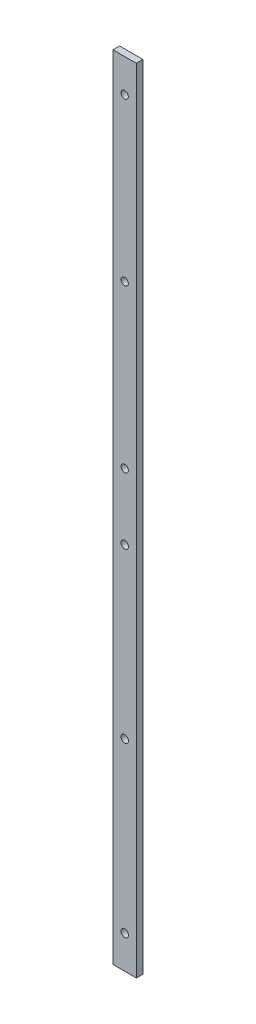
ISO-10303-21;
HEADER;
FILE_DESCRIPTION(('STEP AP214'),'2;1');
FILE_NAME('part.step','',(''),(''),'','','');
FILE_SCHEMA(('AUTOMOTIVE_DESIGN { 1 0 10303 214 1 1 1 1 }'));
ENDSEC;
DATA;
#1=APPLICATION_CONTEXT('core data for automotive mechanical design processes');
#2=APPLICATION_PROTOCOL_DEFINITION('international standard','automotive_design',2000,#1);
#3=PRODUCT_CONTEXT('',#1,'mechanical');
#4=PRODUCT('Part','Part','',(#3));
#5=PRODUCT_RELATED_PRODUCT_CATEGORY('part','',(#4));
#6=PRODUCT_DEFINITION_FORMATION('','',#4);
#7=PRODUCT_DEFINITION_CONTEXT('part definition',#1,'design');
#8=PRODUCT_DEFINITION('design','',#6,#7);
#9=PRODUCT_DEFINITION_SHAPE('','',#8);
#10=(LENGTH_UNIT() NAMED_UNIT(*) SI_UNIT(.MILLI.,.METRE.));
#11=(NAMED_UNIT(*) PLANE_ANGLE_UNIT() SI_UNIT($,.RADIAN.));
#12=(NAMED_UNIT(*) SI_UNIT($,.STERADIAN.) SOLID_ANGLE_UNIT());
#13=UNCERTAINTY_MEASURE_WITH_UNIT(LENGTH_MEASURE(1.E-05),#10,'distance_accuracy_value','');
#14=(GEOMETRIC_REPRESENTATION_CONTEXT(3) GLOBAL_UNCERTAINTY_ASSIGNED_CONTEXT((#13)) GLOBAL_UNIT_ASSIGNED_CONTEXT((#10,
#11,#12)) REPRESENTATION_CONTEXT('',''));
#15=CARTESIAN_POINT('',(0.,0.,0.));
#16=DIRECTION('',(0.,0.,1.));
#17=DIRECTION('',(1.,0.,0.));
#18=AXIS2_PLACEMENT_3D('',#15,#16,#17);
#19=CARTESIAN_POINT('',(0.,0.,3.));
#20=DIRECTION('',(0.,0.,1.));
#21=DIRECTION('',(1.,0.,0.));
#22=AXIS2_PLACEMENT_3D('',#19,#20,#21);
#23=PLANE('',#22);
#24=CARTESIAN_POINT('',(70.8508489375318,-31.6991439461708,3.));
#25=DIRECTION('',(0.,0.,1.));
#26=DIRECTION('',(1.,0.,0.));
#27=AXIS2_PLACEMENT_3D('',#24,#25,#26);
#28=CIRCLE('',#27,1.70000000000003);
#29=CARTESIAN_POINT('',(72.5508489375318,-31.6991439461708,3.));
#30=VERTEX_POINT('',#29);
#31=EDGE_CURVE('E139',#30,#30,#28,.T.);
#32=ORIENTED_EDGE('',*,*,#31,.F.);
#33=EDGE_LOOP('',(#32));
#34=FACE_BOUND('',#33,.T.);
#35=CARTESIAN_POINT('',(70.8508420677386,74.7510002553463,3.));
#36=DIRECTION('',(0.,0.,1.));
#37=DIRECTION('',(1.,0.,0.));
#38=AXIS2_PLACEMENT_3D('',#35,#36,#37);
#39=CIRCLE('',#38,1.65);
#40=CARTESIAN_POINT('',(72.5008420677386,74.7510002553463,3.));
#41=VERTEX_POINT('',#40);
#42=EDGE_CURVE('E127',#41,#41,#39,.T.);
#43=ORIENTED_EDGE('',*,*,#42,.F.);
#44=EDGE_LOOP('',(#43));
#45=FACE_BOUND('',#44,.T.);
#46=CARTESIAN_POINT('',(70.8508420677386,221.850888729095,3.));
#47=DIRECTION('',(0.,0.,1.));
#48=DIRECTION('',(1.,0.,0.));
#49=AXIS2_PLACEMENT_3D('',#46,#47,#48);
#50=CIRCLE('',#49,1.65000000000002);
#51=CARTESIAN_POINT('',(72.5008420677387,221.850888729095,3.));
#52=VERTEX_POINT('',#51);
#53=EDGE_CURVE('E106',#52,#52,#50,.T.);
#54=ORIENTED_EDGE('',*,*,#53,.F.);
#55=EDGE_LOOP('',(#54));
#56=FACE_BOUND('',#55,.T.);
#57=DIRECTION('',(0.,1.,0.));
#58=VECTOR('',#57,1.);
#59=CARTESIAN_POINT('',(76.1518031358719,236.850888729095,3.));
#60=LINE('',#59,#58);
#61=CARTESIAN_POINT('',(76.1518031358719,-123.149288147688,3.));
#62=VERTEX_POINT('',#61);
#63=CARTESIAN_POINT('',(76.1518031358719,236.850888729095,3.));
#64=VERTEX_POINT('',#63);
#65=EDGE_CURVE('E91',#62,#64,#60,.T.);
#66=ORIENTED_EDGE('',*,*,#65,.T.);
#67=DIRECTION('',(-1.,0.,0.));
#68=VECTOR('',#67,1.);
#69=CARTESIAN_POINT('',(65.5498809996054,236.850888729095,3.));
#70=LINE('',#69,#68);
#71=CARTESIAN_POINT('',(65.5498809996054,236.850888729095,3.));
#72=VERTEX_POINT('',#71);
#73=EDGE_CURVE('E86',#64,#72,#70,.T.);
#74=ORIENTED_EDGE('',*,*,#73,.T.);
#75=DIRECTION('',(3.81654985997715E-08,-0.999999999999999,0.));
#76=VECTOR('',#75,1.);
#77=CARTESIAN_POINT('',(65.5498947391916,-123.149288147688,3.));
#78=LINE('',#77,#76);
#79=CARTESIAN_POINT('',(65.5498947391916,-123.149288147688,3.));
#80=VERTEX_POINT('',#79);
#81=EDGE_CURVE('E89',#72,#80,#78,.T.);
#82=ORIENTED_EDGE('',*,*,#81,.T.);
#83=DIRECTION('',(1.,0.,0.));
#84=VECTOR('',#83,1.);
#85=CARTESIAN_POINT('',(65.5498947391916,-123.149288147688,3.));
#86=LINE('',#85,#84);
#87=EDGE_CURVE('E56',#80,#62,#86,.T.);
#88=ORIENTED_EDGE('',*,*,#87,.T.);
#89=EDGE_LOOP('',(#66,#74,#82,#88));
#90=FACE_BOUND('',#89,.T.);
#91=CARTESIAN_POINT('',(70.8508420677386,148.300944492221,3.));
#92=DIRECTION('',(0.,0.,1.));
#93=DIRECTION('',(1.,0.,0.));
#94=AXIS2_PLACEMENT_3D('',#91,#92,#93);
#95=CIRCLE('',#94,1.65000000000002);
#96=CARTESIAN_POINT('',(72.5008420677387,148.300944492221,3.));
#97=VERTEX_POINT('',#96);
#98=EDGE_CURVE('E121',#97,#97,#95,.T.);
#99=ORIENTED_EDGE('',*,*,#98,.F.);
#100=EDGE_LOOP('',(#99));
#101=FACE_BOUND('',#100,.T.);
#102=CARTESIAN_POINT('',(70.8508489375317,44.7510002553463,3.));
#103=DIRECTION('',(0.,0.,1.));
#104=DIRECTION('',(1.,0.,0.));
#105=AXIS2_PLACEMENT_3D('',#102,#103,#104);
#106=CIRCLE('',#105,1.7);
#107=CARTESIAN_POINT('',(72.5508489375317,44.7510002553463,3.));
#108=VERTEX_POINT('',#107);
#109=EDGE_CURVE('E133',#108,#108,#106,.T.);
#110=ORIENTED_EDGE('',*,*,#109,.F.);
#111=EDGE_LOOP('',(#110));
#112=FACE_BOUND('',#111,.T.);
#113=CARTESIAN_POINT('',(70.8508489375318,-108.149288147688,3.));
#114=DIRECTION('',(0.,0.,1.));
#115=DIRECTION('',(1.,0.,0.));
#116=AXIS2_PLACEMENT_3D('',#113,#114,#115);
#117=CIRCLE('',#116,1.69999999999998);
#118=CARTESIAN_POINT('',(72.5508489375317,-108.149288147688,3.));
#119=VERTEX_POINT('',#118);
#120=EDGE_CURVE('E145',#119,#119,#117,.T.);
#121=ORIENTED_EDGE('',*,*,#120,.F.);
#122=EDGE_LOOP('',(#121));
#123=FACE_BOUND('',#122,.T.);
#124=ADVANCED_FACE('F39',(#34,#45,#56,#90,#101,#112,#123),#23,.T.);
#125=CARTESIAN_POINT('',(0.,0.,0.));
#126=DIRECTION('',(0.,0.,1.));
#127=DIRECTION('',(1.,0.,0.));
#128=AXIS2_PLACEMENT_3D('',#125,#126,#127);
#129=PLANE('',#128);
#130=DIRECTION('',(0.,1.,0.));
#131=VECTOR('',#130,1.);
#132=CARTESIAN_POINT('',(76.1518031358719,236.850888729095,0.));
#133=LINE('',#132,#131);
#134=CARTESIAN_POINT('',(76.1518031358719,-123.149288147688,0.));
#135=VERTEX_POINT('',#134);
#136=CARTESIAN_POINT('',(76.1518031358719,236.850888729095,0.));
#137=VERTEX_POINT('',#136);
#138=EDGE_CURVE('E103',#135,#137,#133,.T.);
#139=ORIENTED_EDGE('',*,*,#138,.F.);
#140=DIRECTION('',(1.,0.,0.));
#141=VECTOR('',#140,1.);
#142=CARTESIAN_POINT('',(65.5498947391916,-123.149288147688,0.));
#143=LINE('',#142,#141);
#144=CARTESIAN_POINT('',(65.5498947391916,-123.149288147688,0.));
#145=VERTEX_POINT('',#144);
#146=EDGE_CURVE('E79',#145,#135,#143,.T.);
#147=ORIENTED_EDGE('',*,*,#146,.F.);
#148=DIRECTION('',(3.81654985997715E-08,-0.999999999999999,0.));
#149=VECTOR('',#148,1.);
#150=CARTESIAN_POINT('',(65.5498947391916,-123.149288147688,0.));
#151=LINE('',#150,#149);
#152=CARTESIAN_POINT('',(65.5498809996054,236.850888729095,0.));
#153=VERTEX_POINT('',#152);
#154=EDGE_CURVE('E73',#153,#145,#151,.T.);
#155=ORIENTED_EDGE('',*,*,#154,.F.);
#156=DIRECTION('',(-1.,0.,0.));
#157=VECTOR('',#156,1.);
#158=CARTESIAN_POINT('',(65.5498809996054,236.850888729095,0.));
#159=LINE('',#158,#157);
#160=EDGE_CURVE('E95',#137,#153,#159,.T.);
#161=ORIENTED_EDGE('',*,*,#160,.F.);
#162=EDGE_LOOP('',(#139,#147,#155,#161));
#163=FACE_BOUND('',#162,.T.);
#164=CARTESIAN_POINT('',(70.8508420677386,221.850888729095,0.));
#165=DIRECTION('',(0.,0.,1.));
#166=DIRECTION('',(1.,0.,0.));
#167=AXIS2_PLACEMENT_3D('',#164,#165,#166);
#168=CIRCLE('',#167,1.65000000000002);
#169=CARTESIAN_POINT('',(72.5008420677387,221.850888729095,0.));
#170=VERTEX_POINT('',#169);
#171=EDGE_CURVE('E118',#170,#170,#168,.T.);
#172=ORIENTED_EDGE('',*,*,#171,.T.);
#173=EDGE_LOOP('',(#172));
#174=FACE_BOUND('',#173,.T.);
#175=CARTESIAN_POINT('',(70.8508420677386,148.300944492221,0.));
#176=DIRECTION('',(0.,0.,1.));
#177=DIRECTION('',(1.,0.,0.));
#178=AXIS2_PLACEMENT_3D('',#175,#176,#177);
#179=CIRCLE('',#178,1.65000000000002);
#180=CARTESIAN_POINT('',(72.5008420677387,148.300944492221,0.));
#181=VERTEX_POINT('',#180);
#182=EDGE_CURVE('E124',#181,#181,#179,.T.);
#183=ORIENTED_EDGE('',*,*,#182,.T.);
#184=EDGE_LOOP('',(#183));
#185=FACE_BOUND('',#184,.T.);
#186=CARTESIAN_POINT('',(70.8508420677386,74.7510002553463,0.));
#187=DIRECTION('',(0.,0.,1.));
#188=DIRECTION('',(1.,0.,0.));
#189=AXIS2_PLACEMENT_3D('',#186,#187,#188);
#190=CIRCLE('',#189,1.65);
#191=CARTESIAN_POINT('',(72.5008420677386,74.7510002553463,0.));
#192=VERTEX_POINT('',#191);
#193=EDGE_CURVE('E130',#192,#192,#190,.T.);
#194=ORIENTED_EDGE('',*,*,#193,.T.);
#195=EDGE_LOOP('',(#194));
#196=FACE_BOUND('',#195,.T.);
#197=CARTESIAN_POINT('',(70.8508489375317,44.7510002553463,0.));
#198=DIRECTION('',(0.,0.,1.));
#199=DIRECTION('',(1.,0.,0.));
#200=AXIS2_PLACEMENT_3D('',#197,#198,#199);
#201=CIRCLE('',#200,1.7);
#202=CARTESIAN_POINT('',(72.5508489375317,44.7510002553463,0.));
#203=VERTEX_POINT('',#202);
#204=EDGE_CURVE('E136',#203,#203,#201,.T.);
#205=ORIENTED_EDGE('',*,*,#204,.T.);
#206=EDGE_LOOP('',(#205));
#207=FACE_BOUND('',#206,.T.);
#208=CARTESIAN_POINT('',(70.8508489375318,-31.6991439461708,0.));
#209=DIRECTION('',(0.,0.,1.));
#210=DIRECTION('',(1.,0.,0.));
#211=AXIS2_PLACEMENT_3D('',#208,#209,#210);
#212=CIRCLE('',#211,1.70000000000003);
#213=CARTESIAN_POINT('',(72.5508489375318,-31.6991439461708,0.));
#214=VERTEX_POINT('',#213);
#215=EDGE_CURVE('E142',#214,#214,#212,.T.);
#216=ORIENTED_EDGE('',*,*,#215,.T.);
#217=EDGE_LOOP('',(#216));
#218=FACE_BOUND('',#217,.T.);
#219=CARTESIAN_POINT('',(70.8508489375318,-108.149288147688,0.));
#220=DIRECTION('',(0.,0.,1.));
#221=DIRECTION('',(1.,0.,0.));
#222=AXIS2_PLACEMENT_3D('',#219,#220,#221);
#223=CIRCLE('',#222,1.69999999999998);
#224=CARTESIAN_POINT('',(72.5508489375317,-108.149288147688,0.));
#225=VERTEX_POINT('',#224);
#226=EDGE_CURVE('E148',#225,#225,#223,.T.);
#227=ORIENTED_EDGE('',*,*,#226,.T.);
#228=EDGE_LOOP('',(#227));
#229=FACE_BOUND('',#228,.T.);
#230=ADVANCED_FACE('F114',(#163,#174,#185,#196,#207,#218,#229),#129,.F.);
#231=CARTESIAN_POINT('',(76.1518031358719,236.850888729095,3.));
#232=DIRECTION('',(-1.,0.,0.));
#233=DIRECTION('',(0.,0.,1.));
#234=AXIS2_PLACEMENT_3D('',#231,#232,#233);
#235=PLANE('',#234);
#236=ORIENTED_EDGE('',*,*,#138,.T.);
#237=DIRECTION('',(0.,0.,-1.));
#238=VECTOR('',#237,1.);
#239=CARTESIAN_POINT('',(76.1518031358719,236.850888729095,3.));
#240=LINE('',#239,#238);
#241=EDGE_CURVE('E11',#64,#137,#240,.T.);
#242=ORIENTED_EDGE('',*,*,#241,.F.);
#243=ORIENTED_EDGE('',*,*,#65,.F.);
#244=DIRECTION('',(0.,0.,-1.));
#245=VECTOR('',#244,1.);
#246=CARTESIAN_POINT('',(76.1518031358719,-123.149288147688,3.));
#247=LINE('',#246,#245);
#248=EDGE_CURVE('E99',#62,#135,#247,.T.);
#249=ORIENTED_EDGE('',*,*,#248,.T.);
#250=EDGE_LOOP('',(#236,#242,#243,#249));
#251=FACE_BOUND('',#250,.T.);
#252=ADVANCED_FACE('F41',(#251),#235,.F.);
#253=CARTESIAN_POINT('',(65.5498809996054,236.850888729095,3.));
#254=DIRECTION('',(0.,-1.,0.));
#255=DIRECTION('',(0.,0.,-1.));
#256=AXIS2_PLACEMENT_3D('',#253,#254,#255);
#257=PLANE('',#256);
#258=ORIENTED_EDGE('',*,*,#160,.T.);
#259=DIRECTION('',(0.,0.,-1.));
#260=VECTOR('',#259,1.);
#261=CARTESIAN_POINT('',(65.5498809996054,236.850888729095,3.));
#262=LINE('',#261,#260);
#263=EDGE_CURVE('E48',#72,#153,#262,.T.);
#264=ORIENTED_EDGE('',*,*,#263,.F.);
#265=ORIENTED_EDGE('',*,*,#73,.F.);
#266=ORIENTED_EDGE('',*,*,#241,.T.);
#267=EDGE_LOOP('',(#258,#264,#265,#266));
#268=FACE_BOUND('',#267,.T.);
#269=ADVANCED_FACE('F94',(#268),#257,.F.);
#270=CARTESIAN_POINT('',(65.5498947391916,-123.149288147688,3.));
#271=DIRECTION('',(0.999999999999999,3.81654985997716E-08,0.));
#272=DIRECTION('',(-3.81654985997716E-08,0.999999999999999,0.));
#273=AXIS2_PLACEMENT_3D('',#270,#271,#272);
#274=PLANE('',#273);
#275=ORIENTED_EDGE('',*,*,#154,.T.);
#276=DIRECTION('',(0.,0.,-1.));
#277=VECTOR('',#276,1.);
#278=CARTESIAN_POINT('',(65.5498947391916,-123.149288147688,3.));
#279=LINE('',#278,#277);
#280=EDGE_CURVE('E96',#80,#145,#279,.T.);
#281=ORIENTED_EDGE('',*,*,#280,.F.);
#282=ORIENTED_EDGE('',*,*,#81,.F.);
#283=ORIENTED_EDGE('',*,*,#263,.T.);
#284=EDGE_LOOP('',(#275,#281,#282,#283));
#285=FACE_BOUND('',#284,.T.);
#286=ADVANCED_FACE('F97',(#285),#274,.F.);
#287=CARTESIAN_POINT('',(65.5498947391916,-123.149288147688,3.));
#288=DIRECTION('',(0.,1.,0.));
#289=DIRECTION('',(0.,0.,1.));
#290=AXIS2_PLACEMENT_3D('',#287,#288,#289);
#291=PLANE('',#290);
#292=ORIENTED_EDGE('',*,*,#146,.T.);
#293=ORIENTED_EDGE('',*,*,#248,.F.);
#294=ORIENTED_EDGE('',*,*,#87,.F.);
#295=ORIENTED_EDGE('',*,*,#280,.T.);
#296=EDGE_LOOP('',(#292,#293,#294,#295));
#297=FACE_BOUND('',#296,.T.);
#298=ADVANCED_FACE('F111',(#297),#291,.F.);
#299=CARTESIAN_POINT('',(70.8508420677386,221.850888729095,3.));
#300=DIRECTION('',(0.,0.,-1.));
#301=DIRECTION('',(-1.,0.,0.));
#302=AXIS2_PLACEMENT_3D('',#299,#300,#301);
#303=CYLINDRICAL_SURFACE('',#302,1.65000000000002);
#304=ORIENTED_EDGE('',*,*,#53,.T.);
#305=EDGE_LOOP('',(#304));
#306=FACE_BOUND('',#305,.T.);
#307=ORIENTED_EDGE('',*,*,#171,.F.);
#308=EDGE_LOOP('',(#307));
#309=FACE_BOUND('',#308,.T.);
#310=ADVANCED_FACE('F167',(#306,#309),#303,.F.);
#311=CARTESIAN_POINT('',(70.8508420677386,148.300944492221,3.));
#312=DIRECTION('',(0.,0.,-1.));
#313=DIRECTION('',(-1.,0.,0.));
#314=AXIS2_PLACEMENT_3D('',#311,#312,#313);
#315=CYLINDRICAL_SURFACE('',#314,1.65000000000002);
#316=ORIENTED_EDGE('',*,*,#98,.T.);
#317=EDGE_LOOP('',(#316));
#318=FACE_BOUND('',#317,.T.);
#319=ORIENTED_EDGE('',*,*,#182,.F.);
#320=EDGE_LOOP('',(#319));
#321=FACE_BOUND('',#320,.T.);
#322=ADVANCED_FACE('F212',(#318,#321),#315,.F.);
#323=CARTESIAN_POINT('',(70.8508420677386,74.7510002553463,3.));
#324=DIRECTION('',(0.,0.,-1.));
#325=DIRECTION('',(-1.,0.,0.));
#326=AXIS2_PLACEMENT_3D('',#323,#324,#325);
#327=CYLINDRICAL_SURFACE('',#326,1.65);
#328=ORIENTED_EDGE('',*,*,#42,.T.);
#329=EDGE_LOOP('',(#328));
#330=FACE_BOUND('',#329,.T.);
#331=ORIENTED_EDGE('',*,*,#193,.F.);
#332=EDGE_LOOP('',(#331));
#333=FACE_BOUND('',#332,.T.);
#334=ADVANCED_FACE('F220',(#330,#333),#327,.F.);
#335=CARTESIAN_POINT('',(70.8508489375317,44.7510002553463,3.));
#336=DIRECTION('',(0.,0.,-1.));
#337=DIRECTION('',(-1.,0.,0.));
#338=AXIS2_PLACEMENT_3D('',#335,#336,#337);
#339=CYLINDRICAL_SURFACE('',#338,1.7);
#340=ORIENTED_EDGE('',*,*,#109,.T.);
#341=EDGE_LOOP('',(#340));
#342=FACE_BOUND('',#341,.T.);
#343=ORIENTED_EDGE('',*,*,#204,.F.);
#344=EDGE_LOOP('',(#343));
#345=FACE_BOUND('',#344,.T.);
#346=ADVANCED_FACE('F228',(#342,#345),#339,.F.);
#347=CARTESIAN_POINT('',(70.8508489375318,-31.6991439461708,3.));
#348=DIRECTION('',(0.,0.,-1.));
#349=DIRECTION('',(-1.,0.,0.));
#350=AXIS2_PLACEMENT_3D('',#347,#348,#349);
#351=CYLINDRICAL_SURFACE('',#350,1.70000000000003);
#352=ORIENTED_EDGE('',*,*,#31,.T.);
#353=EDGE_LOOP('',(#352));
#354=FACE_BOUND('',#353,.T.);
#355=ORIENTED_EDGE('',*,*,#215,.F.);
#356=EDGE_LOOP('',(#355));
#357=FACE_BOUND('',#356,.T.);
#358=ADVANCED_FACE('F237',(#354,#357),#351,.F.);
#359=CARTESIAN_POINT('',(70.8508489375318,-108.149288147688,3.));
#360=DIRECTION('',(0.,0.,-1.));
#361=DIRECTION('',(-1.,0.,0.));
#362=AXIS2_PLACEMENT_3D('',#359,#360,#361);
#363=CYLINDRICAL_SURFACE('',#362,1.69999999999998);
#364=ORIENTED_EDGE('',*,*,#120,.T.);
#365=EDGE_LOOP('',(#364));
#366=FACE_BOUND('',#365,.T.);
#367=ORIENTED_EDGE('',*,*,#226,.F.);
#368=EDGE_LOOP('',(#367));
#369=FACE_BOUND('',#368,.T.);
#370=ADVANCED_FACE('F154',(#366,#369),#363,.F.);
#371=CLOSED_SHELL('',(#124,#230,#252,#269,#286,#298,#310,#322,#334,#346,#358,#370));
#372=MANIFOLD_SOLID_BREP('B2',#371);
#373=ADVANCED_BREP_SHAPE_REPRESENTATION('',(#18,#372),#14);
#374=SHAPE_DEFINITION_REPRESENTATION(#9,#373);
ENDSEC;
END-ISO-10303-21;
